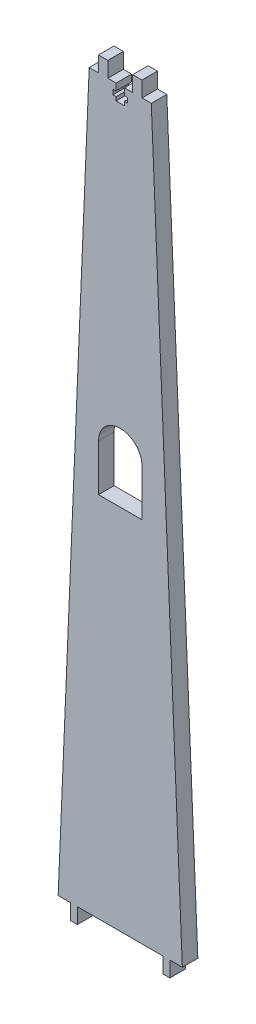
ISO-10303-21;
HEADER;
FILE_DESCRIPTION(('STEP AP214'),'2;1');
FILE_NAME('part.step','',(''),(''),'','','');
FILE_SCHEMA(('AUTOMOTIVE_DESIGN { 1 0 10303 214 1 1 1 1 }'));
ENDSEC;
DATA;
#1=APPLICATION_CONTEXT('core data for automotive mechanical design processes');
#2=APPLICATION_PROTOCOL_DEFINITION('international standard','automotive_design',2000,#1);
#3=PRODUCT_CONTEXT('',#1,'mechanical');
#4=PRODUCT('Part','Part','',(#3));
#5=PRODUCT_RELATED_PRODUCT_CATEGORY('part','',(#4));
#6=PRODUCT_DEFINITION_FORMATION('','',#4);
#7=PRODUCT_DEFINITION_CONTEXT('part definition',#1,'design');
#8=PRODUCT_DEFINITION('design','',#6,#7);
#9=PRODUCT_DEFINITION_SHAPE('','',#8);
#10=(LENGTH_UNIT() NAMED_UNIT(*) SI_UNIT(.MILLI.,.METRE.));
#11=(NAMED_UNIT(*) PLANE_ANGLE_UNIT() SI_UNIT($,.RADIAN.));
#12=(NAMED_UNIT(*) SI_UNIT($,.STERADIAN.) SOLID_ANGLE_UNIT());
#13=UNCERTAINTY_MEASURE_WITH_UNIT(LENGTH_MEASURE(1.E-05),#10,'distance_accuracy_value','');
#14=(GEOMETRIC_REPRESENTATION_CONTEXT(3) GLOBAL_UNCERTAINTY_ASSIGNED_CONTEXT((#13)) GLOBAL_UNIT_ASSIGNED_CONTEXT((#10,
#11,#12)) REPRESENTATION_CONTEXT('',''));
#15=CARTESIAN_POINT('',(0.,0.,0.));
#16=DIRECTION('',(0.,0.,1.));
#17=DIRECTION('',(1.,0.,0.));
#18=AXIS2_PLACEMENT_3D('',#15,#16,#17);
#19=CARTESIAN_POINT('',(0.,0.,6.35));
#20=DIRECTION('',(0.,0.,-1.));
#21=DIRECTION('',(-1.,0.,0.));
#22=AXIS2_PLACEMENT_3D('',#19,#20,#21);
#23=PLANE('',#22);
#24=DIRECTION('',(1.,0.,0.));
#25=VECTOR('',#24,1.);
#26=CARTESIAN_POINT('',(-25.4,0.,6.35));
#27=LINE('',#26,#25);
#28=CARTESIAN_POINT('',(-25.4,0.,6.35));
#29=VERTEX_POINT('',#28);
#30=CARTESIAN_POINT('',(-20.3200000000001,0.,6.35));
#31=VERTEX_POINT('',#30);
#32=EDGE_CURVE('E308',#29,#31,#27,.T.);
#33=ORIENTED_EDGE('',*,*,#32,.T.);
#34=DIRECTION('',(0.,-1.,0.));
#35=VECTOR('',#34,1.);
#36=CARTESIAN_POINT('',(-20.3200000000001,0.,6.35));
#37=LINE('',#36,#35);
#38=CARTESIAN_POINT('',(-20.32,-6.35,6.35));
#39=VERTEX_POINT('',#38);
#40=EDGE_CURVE('E311',#31,#39,#37,.T.);
#41=ORIENTED_EDGE('',*,*,#40,.T.);
#42=DIRECTION('',(1.,0.,0.));
#43=VECTOR('',#42,1.);
#44=CARTESIAN_POINT('',(-20.32,-6.35,6.35));
#45=LINE('',#44,#43);
#46=CARTESIAN_POINT('',(-17.5260000000001,-6.35,6.35));
#47=VERTEX_POINT('',#46);
#48=EDGE_CURVE('E314',#39,#47,#45,.T.);
#49=ORIENTED_EDGE('',*,*,#48,.T.);
#50=DIRECTION('',(0.,1.,0.));
#51=VECTOR('',#50,1.);
#52=CARTESIAN_POINT('',(-17.5260000000001,-6.35,6.35));
#53=LINE('',#52,#51);
#54=CARTESIAN_POINT('',(-17.526,0.,6.35));
#55=VERTEX_POINT('',#54);
#56=EDGE_CURVE('E316',#47,#55,#53,.T.);
#57=ORIENTED_EDGE('',*,*,#56,.T.);
#58=DIRECTION('',(1.,0.,0.));
#59=VECTOR('',#58,1.);
#60=CARTESIAN_POINT('',(-17.526,0.,6.35));
#61=LINE('',#60,#59);
#62=CARTESIAN_POINT('',(17.526,0.,6.35));
#63=VERTEX_POINT('',#62);
#64=EDGE_CURVE('E318',#55,#63,#61,.T.);
#65=ORIENTED_EDGE('',*,*,#64,.T.);
#66=DIRECTION('',(0.,-1.,0.));
#67=VECTOR('',#66,1.);
#68=CARTESIAN_POINT('',(17.5260000000001,-6.35,6.35));
#69=LINE('',#68,#67);
#70=CARTESIAN_POINT('',(17.5260000000001,-6.35,6.35));
#71=VERTEX_POINT('',#70);
#72=EDGE_CURVE('E320',#63,#71,#69,.T.);
#73=ORIENTED_EDGE('',*,*,#72,.T.);
#74=DIRECTION('',(1.,0.,0.));
#75=VECTOR('',#74,1.);
#76=CARTESIAN_POINT('',(20.3200000000001,-6.35,6.35));
#77=LINE('',#76,#75);
#78=CARTESIAN_POINT('',(20.3200000000001,-6.35,6.35));
#79=VERTEX_POINT('',#78);
#80=EDGE_CURVE('E322',#71,#79,#77,.T.);
#81=ORIENTED_EDGE('',*,*,#80,.T.);
#82=DIRECTION('',(0.,1.,0.));
#83=VECTOR('',#82,1.);
#84=CARTESIAN_POINT('',(20.3200000000001,0.,6.35));
#85=LINE('',#84,#83);
#86=CARTESIAN_POINT('',(20.3200000000001,0.,6.35));
#87=VERTEX_POINT('',#86);
#88=EDGE_CURVE('E324',#79,#87,#85,.T.);
#89=ORIENTED_EDGE('',*,*,#88,.T.);
#90=DIRECTION('',(1.,0.,0.));
#91=VECTOR('',#90,1.);
#92=CARTESIAN_POINT('',(25.4,0.,6.35));
#93=LINE('',#92,#91);
#94=CARTESIAN_POINT('',(25.4,0.,6.35));
#95=VERTEX_POINT('',#94);
#96=EDGE_CURVE('E326',#87,#95,#93,.T.);
#97=ORIENTED_EDGE('',*,*,#96,.T.);
#98=DIRECTION('',(-0.0423348930736044,0.999103476537064,0.));
#99=VECTOR('',#98,1.);
#100=CARTESIAN_POINT('',(25.4,0.,6.35));
#101=LINE('',#100,#99);
#102=CARTESIAN_POINT('',(12.7,299.72,6.35));
#103=VERTEX_POINT('',#102);
#104=EDGE_CURVE('E328',#95,#103,#101,.T.);
#105=ORIENTED_EDGE('',*,*,#104,.T.);
#106=DIRECTION('',(-1.,0.,0.));
#107=VECTOR('',#106,1.);
#108=CARTESIAN_POINT('',(12.7,299.72,6.35));
#109=LINE('',#108,#107);
#110=CARTESIAN_POINT('',(8.89,299.72,6.35));
#111=VERTEX_POINT('',#110);
#112=EDGE_CURVE('E330',#103,#111,#109,.T.);
#113=ORIENTED_EDGE('',*,*,#112,.T.);
#114=DIRECTION('',(0.,1.,0.));
#115=VECTOR('',#114,1.);
#116=CARTESIAN_POINT('',(8.89,306.07,6.35));
#117=LINE('',#116,#115);
#118=CARTESIAN_POINT('',(8.89,306.07,6.35));
#119=VERTEX_POINT('',#118);
#120=EDGE_CURVE('E332',#111,#119,#117,.T.);
#121=ORIENTED_EDGE('',*,*,#120,.T.);
#122=DIRECTION('',(-1.,0.,0.));
#123=VECTOR('',#122,1.);
#124=CARTESIAN_POINT('',(8.89,306.07,6.35));
#125=LINE('',#124,#123);
#126=CARTESIAN_POINT('',(5.08,306.07,6.35));
#127=VERTEX_POINT('',#126);
#128=EDGE_CURVE('E334',#119,#127,#125,.T.);
#129=ORIENTED_EDGE('',*,*,#128,.T.);
#130=DIRECTION('',(0.,-1.,0.));
#131=VECTOR('',#130,1.);
#132=CARTESIAN_POINT('',(5.08,306.07,6.35));
#133=LINE('',#132,#131);
#134=CARTESIAN_POINT('',(5.08,299.72,6.35));
#135=VERTEX_POINT('',#134);
#136=EDGE_CURVE('E336',#127,#135,#133,.T.);
#137=ORIENTED_EDGE('',*,*,#136,.T.);
#138=DIRECTION('',(-1.,0.,0.));
#139=VECTOR('',#138,1.);
#140=CARTESIAN_POINT('',(5.08,299.72,6.35));
#141=LINE('',#140,#139);
#142=CARTESIAN_POINT('',(1.7,299.72,6.35));
#143=VERTEX_POINT('',#142);
#144=EDGE_CURVE('E338',#135,#143,#141,.T.);
#145=ORIENTED_EDGE('',*,*,#144,.T.);
#146=DIRECTION('',(0.,-1.,0.));
#147=VECTOR('',#146,1.);
#148=CARTESIAN_POINT('',(1.7,299.72,6.35));
#149=LINE('',#148,#147);
#150=CARTESIAN_POINT('',(1.7,296.926,6.35));
#151=VERTEX_POINT('',#150);
#152=EDGE_CURVE('E340',#143,#151,#149,.T.);
#153=ORIENTED_EDGE('',*,*,#152,.T.);
#154=DIRECTION('',(1.,0.,0.));
#155=VECTOR('',#154,1.);
#156=CARTESIAN_POINT('',(1.7,296.926,6.35));
#157=LINE('',#156,#155);
#158=CARTESIAN_POINT('',(2.97,296.926,6.35));
#159=VERTEX_POINT('',#158);
#160=EDGE_CURVE('E342',#151,#159,#157,.T.);
#161=ORIENTED_EDGE('',*,*,#160,.T.);
#162=DIRECTION('',(0.,-1.,0.));
#163=VECTOR('',#162,1.);
#164=CARTESIAN_POINT('',(2.97,296.926,6.35));
#165=LINE('',#164,#163);
#166=CARTESIAN_POINT('',(2.97,294.894,6.35));
#167=VERTEX_POINT('',#166);
#168=EDGE_CURVE('E344',#159,#167,#165,.T.);
#169=ORIENTED_EDGE('',*,*,#168,.T.);
#170=DIRECTION('',(-1.,0.,0.));
#171=VECTOR('',#170,1.);
#172=CARTESIAN_POINT('',(2.97,294.894,6.35));
#173=LINE('',#172,#171);
#174=CARTESIAN_POINT('',(1.7,294.894,6.35));
#175=VERTEX_POINT('',#174);
#176=EDGE_CURVE('E346',#167,#175,#173,.T.);
#177=ORIENTED_EDGE('',*,*,#176,.T.);
#178=DIRECTION('',(0.,-1.,0.));
#179=VECTOR('',#178,1.);
#180=CARTESIAN_POINT('',(1.7,294.894,6.35));
#181=LINE('',#180,#179);
#182=CARTESIAN_POINT('',(1.7,293.37,6.35));
#183=VERTEX_POINT('',#182);
#184=EDGE_CURVE('E348',#175,#183,#181,.T.);
#185=ORIENTED_EDGE('',*,*,#184,.T.);
#186=DIRECTION('',(-1.,0.,0.));
#187=VECTOR('',#186,1.);
#188=CARTESIAN_POINT('',(1.7,293.37,6.35));
#189=LINE('',#188,#187);
#190=CARTESIAN_POINT('',(-1.7,293.37,6.35));
#191=VERTEX_POINT('',#190);
#192=EDGE_CURVE('E350',#183,#191,#189,.T.);
#193=ORIENTED_EDGE('',*,*,#192,.T.);
#194=DIRECTION('',(0.,1.,0.));
#195=VECTOR('',#194,1.);
#196=CARTESIAN_POINT('',(-1.7,294.894,6.35));
#197=LINE('',#196,#195);
#198=CARTESIAN_POINT('',(-1.7,294.894,6.35));
#199=VERTEX_POINT('',#198);
#200=EDGE_CURVE('E352',#191,#199,#197,.T.);
#201=ORIENTED_EDGE('',*,*,#200,.T.);
#202=DIRECTION('',(-1.,0.,0.));
#203=VECTOR('',#202,1.);
#204=CARTESIAN_POINT('',(-2.97,294.894,6.35));
#205=LINE('',#204,#203);
#206=CARTESIAN_POINT('',(-2.97,294.894,6.35));
#207=VERTEX_POINT('',#206);
#208=EDGE_CURVE('E354',#199,#207,#205,.T.);
#209=ORIENTED_EDGE('',*,*,#208,.T.);
#210=DIRECTION('',(0.,1.,0.));
#211=VECTOR('',#210,1.);
#212=CARTESIAN_POINT('',(-2.97,296.926,6.35));
#213=LINE('',#212,#211);
#214=CARTESIAN_POINT('',(-2.97,296.926,6.35));
#215=VERTEX_POINT('',#214);
#216=EDGE_CURVE('E356',#207,#215,#213,.T.);
#217=ORIENTED_EDGE('',*,*,#216,.T.);
#218=DIRECTION('',(1.,0.,0.));
#219=VECTOR('',#218,1.);
#220=CARTESIAN_POINT('',(-1.7,296.926,6.35));
#221=LINE('',#220,#219);
#222=CARTESIAN_POINT('',(-1.7,296.926,6.35));
#223=VERTEX_POINT('',#222);
#224=EDGE_CURVE('E358',#215,#223,#221,.T.);
#225=ORIENTED_EDGE('',*,*,#224,.T.);
#226=DIRECTION('',(0.,1.,0.));
#227=VECTOR('',#226,1.);
#228=CARTESIAN_POINT('',(-1.7,299.72,6.35));
#229=LINE('',#228,#227);
#230=CARTESIAN_POINT('',(-1.7,299.72,6.35));
#231=VERTEX_POINT('',#230);
#232=EDGE_CURVE('E360',#223,#231,#229,.T.);
#233=ORIENTED_EDGE('',*,*,#232,.T.);
#234=DIRECTION('',(-1.,0.,0.));
#235=VECTOR('',#234,1.);
#236=CARTESIAN_POINT('',(-5.08,299.72,6.35));
#237=LINE('',#236,#235);
#238=CARTESIAN_POINT('',(-5.08,299.72,6.35));
#239=VERTEX_POINT('',#238);
#240=EDGE_CURVE('E362',#231,#239,#237,.T.);
#241=ORIENTED_EDGE('',*,*,#240,.T.);
#242=DIRECTION('',(0.,1.,0.));
#243=VECTOR('',#242,1.);
#244=CARTESIAN_POINT('',(-5.08,306.07,6.35));
#245=LINE('',#244,#243);
#246=CARTESIAN_POINT('',(-5.08,306.07,6.35));
#247=VERTEX_POINT('',#246);
#248=EDGE_CURVE('E364',#239,#247,#245,.T.);
#249=ORIENTED_EDGE('',*,*,#248,.T.);
#250=DIRECTION('',(-1.,0.,0.));
#251=VECTOR('',#250,1.);
#252=CARTESIAN_POINT('',(-8.89,306.07,6.35));
#253=LINE('',#252,#251);
#254=CARTESIAN_POINT('',(-8.89,306.07,6.35));
#255=VERTEX_POINT('',#254);
#256=EDGE_CURVE('E366',#247,#255,#253,.T.);
#257=ORIENTED_EDGE('',*,*,#256,.T.);
#258=DIRECTION('',(0.,-1.,0.));
#259=VECTOR('',#258,1.);
#260=CARTESIAN_POINT('',(-8.89,306.07,6.35));
#261=LINE('',#260,#259);
#262=CARTESIAN_POINT('',(-8.89,299.72,6.35));
#263=VERTEX_POINT('',#262);
#264=EDGE_CURVE('E368',#255,#263,#261,.T.);
#265=ORIENTED_EDGE('',*,*,#264,.T.);
#266=DIRECTION('',(-1.,0.,0.));
#267=VECTOR('',#266,1.);
#268=CARTESIAN_POINT('',(-12.7,299.72,6.35));
#269=LINE('',#268,#267);
#270=CARTESIAN_POINT('',(-12.7,299.72,6.35));
#271=VERTEX_POINT('',#270);
#272=EDGE_CURVE('E370',#263,#271,#269,.T.);
#273=ORIENTED_EDGE('',*,*,#272,.T.);
#274=DIRECTION('',(-0.0423348930736044,-0.999103476537064,0.));
#275=VECTOR('',#274,1.);
#276=CARTESIAN_POINT('',(-12.7,299.72,6.35));
#277=LINE('',#276,#275);
#278=EDGE_CURVE('E372',#271,#29,#277,.T.);
#279=ORIENTED_EDGE('',*,*,#278,.T.);
#280=EDGE_LOOP('',(#33,#41,#49,#57,#65,#73,#81,#89,#97,#105,#113,#121,#129,#137,#145,#153,#161,
#169,#177,#185,#193,#201,#209,#217,#225,#233,#241,#249,#257,#265,#273,#279));
#281=FACE_BOUND('',#280,.T.);
#282=DIRECTION('',(0.,-1.,0.));
#283=VECTOR('',#282,1.);
#284=CARTESIAN_POINT('',(-8.89,169.347214184084,6.35));
#285=LINE('',#284,#283);
#286=CARTESIAN_POINT('',(-8.89,169.347214184084,6.35));
#287=VERTEX_POINT('',#286);
#288=CARTESIAN_POINT('',(-8.89,150.297214184084,6.35));
#289=VERTEX_POINT('',#288);
#290=EDGE_CURVE('E272',#287,#289,#285,.T.);
#291=ORIENTED_EDGE('',*,*,#290,.F.);
#292=CARTESIAN_POINT('',(0.,169.347214184084,6.35));
#293=DIRECTION('',(0.,0.,1.));
#294=DIRECTION('',(-1.,0.,0.));
#295=AXIS2_PLACEMENT_3D('',#292,#293,#294);
#296=CIRCLE('',#295,8.89);
#297=CARTESIAN_POINT('',(8.88999999999999,169.347214184084,6.35));
#298=VERTEX_POINT('',#297);
#299=EDGE_CURVE('E294',#298,#287,#296,.T.);
#300=ORIENTED_EDGE('',*,*,#299,.F.);
#301=DIRECTION('',(0.,1.,0.));
#302=VECTOR('',#301,1.);
#303=CARTESIAN_POINT('',(8.89,169.347214184084,6.35));
#304=LINE('',#303,#302);
#305=CARTESIAN_POINT('',(8.89,150.297214184084,6.35));
#306=VERTEX_POINT('',#305);
#307=EDGE_CURVE('E292',#306,#298,#304,.T.);
#308=ORIENTED_EDGE('',*,*,#307,.F.);
#309=DIRECTION('',(1.,0.,0.));
#310=VECTOR('',#309,1.);
#311=CARTESIAN_POINT('',(-8.89,150.297214184084,6.35));
#312=LINE('',#311,#310);
#313=EDGE_CURVE('E280',#289,#306,#312,.T.);
#314=ORIENTED_EDGE('',*,*,#313,.F.);
#315=EDGE_LOOP('',(#291,#300,#308,#314));
#316=FACE_BOUND('',#315,.T.);
#317=ADVANCED_FACE('F39',(#281,#316),#23,.F.);
#318=CARTESIAN_POINT('',(0.,0.,0.));
#319=DIRECTION('',(0.,0.,-1.));
#320=DIRECTION('',(-1.,0.,0.));
#321=AXIS2_PLACEMENT_3D('',#318,#319,#320);
#322=PLANE('',#321);
#323=DIRECTION('',(1.,0.,0.));
#324=VECTOR('',#323,1.);
#325=CARTESIAN_POINT('',(-25.4,0.,0.));
#326=LINE('',#325,#324);
#327=CARTESIAN_POINT('',(-25.4,0.,0.));
#328=VERTEX_POINT('',#327);
#329=CARTESIAN_POINT('',(-20.3200000000001,0.,0.));
#330=VERTEX_POINT('',#329);
#331=EDGE_CURVE('E288',#328,#330,#326,.T.);
#332=ORIENTED_EDGE('',*,*,#331,.F.);
#333=DIRECTION('',(-0.0423348930736044,-0.999103476537064,0.));
#334=VECTOR('',#333,1.);
#335=CARTESIAN_POINT('',(-12.7,299.72,0.));
#336=LINE('',#335,#334);
#337=CARTESIAN_POINT('',(-12.7,299.72,0.));
#338=VERTEX_POINT('',#337);
#339=EDGE_CURVE('E312',#338,#328,#336,.T.);
#340=ORIENTED_EDGE('',*,*,#339,.F.);
#341=DIRECTION('',(-1.,0.,0.));
#342=VECTOR('',#341,1.);
#343=CARTESIAN_POINT('',(-12.7,299.72,0.));
#344=LINE('',#343,#342);
#345=CARTESIAN_POINT('',(-8.89,299.72,0.));
#346=VERTEX_POINT('',#345);
#347=EDGE_CURVE('E435',#346,#338,#344,.T.);
#348=ORIENTED_EDGE('',*,*,#347,.F.);
#349=DIRECTION('',(0.,-1.,0.));
#350=VECTOR('',#349,1.);
#351=CARTESIAN_POINT('',(-8.89,306.07,0.));
#352=LINE('',#351,#350);
#353=CARTESIAN_POINT('',(-8.89,306.07,0.));
#354=VERTEX_POINT('',#353);
#355=EDGE_CURVE('E433',#354,#346,#352,.T.);
#356=ORIENTED_EDGE('',*,*,#355,.F.);
#357=DIRECTION('',(-1.,0.,0.));
#358=VECTOR('',#357,1.);
#359=CARTESIAN_POINT('',(-8.89,306.07,0.));
#360=LINE('',#359,#358);
#361=CARTESIAN_POINT('',(-5.08,306.07,0.));
#362=VERTEX_POINT('',#361);
#363=EDGE_CURVE('E431',#362,#354,#360,.T.);
#364=ORIENTED_EDGE('',*,*,#363,.F.);
#365=DIRECTION('',(0.,1.,0.));
#366=VECTOR('',#365,1.);
#367=CARTESIAN_POINT('',(-5.08,306.07,0.));
#368=LINE('',#367,#366);
#369=CARTESIAN_POINT('',(-5.08,299.72,0.));
#370=VERTEX_POINT('',#369);
#371=EDGE_CURVE('E429',#370,#362,#368,.T.);
#372=ORIENTED_EDGE('',*,*,#371,.F.);
#373=DIRECTION('',(-1.,0.,0.));
#374=VECTOR('',#373,1.);
#375=CARTESIAN_POINT('',(-5.08,299.72,0.));
#376=LINE('',#375,#374);
#377=CARTESIAN_POINT('',(-1.7,299.72,0.));
#378=VERTEX_POINT('',#377);
#379=EDGE_CURVE('E427',#378,#370,#376,.T.);
#380=ORIENTED_EDGE('',*,*,#379,.F.);
#381=DIRECTION('',(0.,1.,0.));
#382=VECTOR('',#381,1.);
#383=CARTESIAN_POINT('',(-1.7,299.72,0.));
#384=LINE('',#383,#382);
#385=CARTESIAN_POINT('',(-1.7,296.926,0.));
#386=VERTEX_POINT('',#385);
#387=EDGE_CURVE('E425',#386,#378,#384,.T.);
#388=ORIENTED_EDGE('',*,*,#387,.F.);
#389=DIRECTION('',(1.,0.,0.));
#390=VECTOR('',#389,1.);
#391=CARTESIAN_POINT('',(-1.7,296.926,0.));
#392=LINE('',#391,#390);
#393=CARTESIAN_POINT('',(-2.97,296.926,0.));
#394=VERTEX_POINT('',#393);
#395=EDGE_CURVE('E423',#394,#386,#392,.T.);
#396=ORIENTED_EDGE('',*,*,#395,.F.);
#397=DIRECTION('',(0.,1.,0.));
#398=VECTOR('',#397,1.);
#399=CARTESIAN_POINT('',(-2.97,296.926,0.));
#400=LINE('',#399,#398);
#401=CARTESIAN_POINT('',(-2.97,294.894,0.));
#402=VERTEX_POINT('',#401);
#403=EDGE_CURVE('E421',#402,#394,#400,.T.);
#404=ORIENTED_EDGE('',*,*,#403,.F.);
#405=DIRECTION('',(-1.,0.,0.));
#406=VECTOR('',#405,1.);
#407=CARTESIAN_POINT('',(-2.97,294.894,0.));
#408=LINE('',#407,#406);
#409=CARTESIAN_POINT('',(-1.7,294.894,0.));
#410=VERTEX_POINT('',#409);
#411=EDGE_CURVE('E419',#410,#402,#408,.T.);
#412=ORIENTED_EDGE('',*,*,#411,.F.);
#413=DIRECTION('',(0.,1.,0.));
#414=VECTOR('',#413,1.);
#415=CARTESIAN_POINT('',(-1.7,294.894,0.));
#416=LINE('',#415,#414);
#417=CARTESIAN_POINT('',(-1.7,293.37,0.));
#418=VERTEX_POINT('',#417);
#419=EDGE_CURVE('E417',#418,#410,#416,.T.);
#420=ORIENTED_EDGE('',*,*,#419,.F.);
#421=DIRECTION('',(-1.,0.,0.));
#422=VECTOR('',#421,1.);
#423=CARTESIAN_POINT('',(1.7,293.37,0.));
#424=LINE('',#423,#422);
#425=CARTESIAN_POINT('',(1.7,293.37,0.));
#426=VERTEX_POINT('',#425);
#427=EDGE_CURVE('E415',#426,#418,#424,.T.);
#428=ORIENTED_EDGE('',*,*,#427,.F.);
#429=DIRECTION('',(0.,-1.,0.));
#430=VECTOR('',#429,1.);
#431=CARTESIAN_POINT('',(1.7,294.894,0.));
#432=LINE('',#431,#430);
#433=CARTESIAN_POINT('',(1.7,294.894,0.));
#434=VERTEX_POINT('',#433);
#435=EDGE_CURVE('E413',#434,#426,#432,.T.);
#436=ORIENTED_EDGE('',*,*,#435,.F.);
#437=DIRECTION('',(-1.,0.,0.));
#438=VECTOR('',#437,1.);
#439=CARTESIAN_POINT('',(2.97,294.894,0.));
#440=LINE('',#439,#438);
#441=CARTESIAN_POINT('',(2.97,294.894,0.));
#442=VERTEX_POINT('',#441);
#443=EDGE_CURVE('E411',#442,#434,#440,.T.);
#444=ORIENTED_EDGE('',*,*,#443,.F.);
#445=DIRECTION('',(0.,-1.,0.));
#446=VECTOR('',#445,1.);
#447=CARTESIAN_POINT('',(2.97,296.926,0.));
#448=LINE('',#447,#446);
#449=CARTESIAN_POINT('',(2.97,296.926,0.));
#450=VERTEX_POINT('',#449);
#451=EDGE_CURVE('E409',#450,#442,#448,.T.);
#452=ORIENTED_EDGE('',*,*,#451,.F.);
#453=DIRECTION('',(1.,0.,0.));
#454=VECTOR('',#453,1.);
#455=CARTESIAN_POINT('',(1.7,296.926,0.));
#456=LINE('',#455,#454);
#457=CARTESIAN_POINT('',(1.7,296.926,0.));
#458=VERTEX_POINT('',#457);
#459=EDGE_CURVE('E407',#458,#450,#456,.T.);
#460=ORIENTED_EDGE('',*,*,#459,.F.);
#461=DIRECTION('',(0.,-1.,0.));
#462=VECTOR('',#461,1.);
#463=CARTESIAN_POINT('',(1.7,299.72,0.));
#464=LINE('',#463,#462);
#465=CARTESIAN_POINT('',(1.7,299.72,0.));
#466=VERTEX_POINT('',#465);
#467=EDGE_CURVE('E405',#466,#458,#464,.T.);
#468=ORIENTED_EDGE('',*,*,#467,.F.);
#469=DIRECTION('',(-1.,0.,0.));
#470=VECTOR('',#469,1.);
#471=CARTESIAN_POINT('',(5.08,299.72,0.));
#472=LINE('',#471,#470);
#473=CARTESIAN_POINT('',(5.08,299.72,0.));
#474=VERTEX_POINT('',#473);
#475=EDGE_CURVE('E403',#474,#466,#472,.T.);
#476=ORIENTED_EDGE('',*,*,#475,.F.);
#477=DIRECTION('',(0.,-1.,0.));
#478=VECTOR('',#477,1.);
#479=CARTESIAN_POINT('',(5.08,306.07,0.));
#480=LINE('',#479,#478);
#481=CARTESIAN_POINT('',(5.08,306.07,0.));
#482=VERTEX_POINT('',#481);
#483=EDGE_CURVE('E401',#482,#474,#480,.T.);
#484=ORIENTED_EDGE('',*,*,#483,.F.);
#485=DIRECTION('',(-1.,0.,0.));
#486=VECTOR('',#485,1.);
#487=CARTESIAN_POINT('',(8.89,306.07,0.));
#488=LINE('',#487,#486);
#489=CARTESIAN_POINT('',(8.89,306.07,0.));
#490=VERTEX_POINT('',#489);
#491=EDGE_CURVE('E399',#490,#482,#488,.T.);
#492=ORIENTED_EDGE('',*,*,#491,.F.);
#493=DIRECTION('',(0.,1.,0.));
#494=VECTOR('',#493,1.);
#495=CARTESIAN_POINT('',(8.89,306.07,0.));
#496=LINE('',#495,#494);
#497=CARTESIAN_POINT('',(8.89,299.72,0.));
#498=VERTEX_POINT('',#497);
#499=EDGE_CURVE('E397',#498,#490,#496,.T.);
#500=ORIENTED_EDGE('',*,*,#499,.F.);
#501=DIRECTION('',(-1.,0.,0.));
#502=VECTOR('',#501,1.);
#503=CARTESIAN_POINT('',(12.7,299.72,0.));
#504=LINE('',#503,#502);
#505=CARTESIAN_POINT('',(12.7,299.72,0.));
#506=VERTEX_POINT('',#505);
#507=EDGE_CURVE('E395',#506,#498,#504,.T.);
#508=ORIENTED_EDGE('',*,*,#507,.F.);
#509=DIRECTION('',(-0.0423348930736044,0.999103476537064,0.));
#510=VECTOR('',#509,1.);
#511=CARTESIAN_POINT('',(25.4,0.,0.));
#512=LINE('',#511,#510);
#513=CARTESIAN_POINT('',(25.4,0.,0.));
#514=VERTEX_POINT('',#513);
#515=EDGE_CURVE('E393',#514,#506,#512,.T.);
#516=ORIENTED_EDGE('',*,*,#515,.F.);
#517=DIRECTION('',(1.,0.,0.));
#518=VECTOR('',#517,1.);
#519=CARTESIAN_POINT('',(25.4,0.,0.));
#520=LINE('',#519,#518);
#521=CARTESIAN_POINT('',(20.3200000000001,0.,0.));
#522=VERTEX_POINT('',#521);
#523=EDGE_CURVE('E391',#522,#514,#520,.T.);
#524=ORIENTED_EDGE('',*,*,#523,.F.);
#525=DIRECTION('',(0.,1.,0.));
#526=VECTOR('',#525,1.);
#527=CARTESIAN_POINT('',(20.3200000000001,0.,0.));
#528=LINE('',#527,#526);
#529=CARTESIAN_POINT('',(20.3200000000001,-6.35,0.));
#530=VERTEX_POINT('',#529);
#531=EDGE_CURVE('E389',#530,#522,#528,.T.);
#532=ORIENTED_EDGE('',*,*,#531,.F.);
#533=DIRECTION('',(1.,0.,0.));
#534=VECTOR('',#533,1.);
#535=CARTESIAN_POINT('',(20.3200000000001,-6.35,0.));
#536=LINE('',#535,#534);
#537=CARTESIAN_POINT('',(17.5260000000001,-6.35,0.));
#538=VERTEX_POINT('',#537);
#539=EDGE_CURVE('E387',#538,#530,#536,.T.);
#540=ORIENTED_EDGE('',*,*,#539,.F.);
#541=DIRECTION('',(0.,-1.,0.));
#542=VECTOR('',#541,1.);
#543=CARTESIAN_POINT('',(17.5260000000001,-6.35,0.));
#544=LINE('',#543,#542);
#545=CARTESIAN_POINT('',(17.526,0.,0.));
#546=VERTEX_POINT('',#545);
#547=EDGE_CURVE('E385',#546,#538,#544,.T.);
#548=ORIENTED_EDGE('',*,*,#547,.F.);
#549=DIRECTION('',(1.,0.,0.));
#550=VECTOR('',#549,1.);
#551=CARTESIAN_POINT('',(-17.526,0.,0.));
#552=LINE('',#551,#550);
#553=CARTESIAN_POINT('',(-17.526,0.,0.));
#554=VERTEX_POINT('',#553);
#555=EDGE_CURVE('E383',#554,#546,#552,.T.);
#556=ORIENTED_EDGE('',*,*,#555,.F.);
#557=DIRECTION('',(0.,1.,0.));
#558=VECTOR('',#557,1.);
#559=CARTESIAN_POINT('',(-17.5260000000001,-6.35,0.));
#560=LINE('',#559,#558);
#561=CARTESIAN_POINT('',(-17.5260000000001,-6.35,0.));
#562=VERTEX_POINT('',#561);
#563=EDGE_CURVE('E381',#562,#554,#560,.T.);
#564=ORIENTED_EDGE('',*,*,#563,.F.);
#565=DIRECTION('',(1.,0.,0.));
#566=VECTOR('',#565,1.);
#567=CARTESIAN_POINT('',(-20.32,-6.35,0.));
#568=LINE('',#567,#566);
#569=CARTESIAN_POINT('',(-20.32,-6.35,0.));
#570=VERTEX_POINT('',#569);
#571=EDGE_CURVE('E379',#570,#562,#568,.T.);
#572=ORIENTED_EDGE('',*,*,#571,.F.);
#573=DIRECTION('',(0.,-1.,0.));
#574=VECTOR('',#573,1.);
#575=CARTESIAN_POINT('',(-20.3200000000001,0.,0.));
#576=LINE('',#575,#574);
#577=EDGE_CURVE('E377',#330,#570,#576,.T.);
#578=ORIENTED_EDGE('',*,*,#577,.F.);
#579=EDGE_LOOP('',(#332,#340,#348,#356,#364,#372,#380,#388,#396,#404,#412,#420,#428,#436,#444,
#452,#460,#468,#476,#484,#492,#500,#508,#516,#524,#532,#540,#548,#556,#564,#572,#578));
#580=FACE_BOUND('',#579,.T.);
#581=CARTESIAN_POINT('',(0.,169.347214184084,0.));
#582=DIRECTION('',(0.,0.,1.));
#583=DIRECTION('',(-1.,0.,0.));
#584=AXIS2_PLACEMENT_3D('',#581,#582,#583);
#585=CIRCLE('',#584,8.89);
#586=CARTESIAN_POINT('',(8.89,169.347214184084,0.));
#587=VERTEX_POINT('',#586);
#588=CARTESIAN_POINT('',(-8.89,169.347214184084,0.));
#589=VERTEX_POINT('',#588);
#590=EDGE_CURVE('E281',#587,#589,#585,.T.);
#591=ORIENTED_EDGE('',*,*,#590,.T.);
#592=DIRECTION('',(0.,-1.,0.));
#593=VECTOR('',#592,1.);
#594=CARTESIAN_POINT('',(-8.89,169.347214184084,0.));
#595=LINE('',#594,#593);
#596=CARTESIAN_POINT('',(-8.89,150.297214184084,0.));
#597=VERTEX_POINT('',#596);
#598=EDGE_CURVE('E62',#589,#597,#595,.T.);
#599=ORIENTED_EDGE('',*,*,#598,.T.);
#600=DIRECTION('',(1.,0.,0.));
#601=VECTOR('',#600,1.);
#602=CARTESIAN_POINT('',(-8.89,150.297214184084,0.));
#603=LINE('',#602,#601);
#604=CARTESIAN_POINT('',(8.89,150.297214184084,0.));
#605=VERTEX_POINT('',#604);
#606=EDGE_CURVE('E287',#597,#605,#603,.T.);
#607=ORIENTED_EDGE('',*,*,#606,.T.);
#608=DIRECTION('',(0.,1.,0.));
#609=VECTOR('',#608,1.);
#610=CARTESIAN_POINT('',(8.89,169.347214184084,0.));
#611=LINE('',#610,#609);
#612=EDGE_CURVE('E300',#605,#587,#611,.T.);
#613=ORIENTED_EDGE('',*,*,#612,.T.);
#614=EDGE_LOOP('',(#591,#599,#607,#613));
#615=FACE_BOUND('',#614,.T.);
#616=ADVANCED_FACE('F537',(#580,#615),#322,.T.);
#617=CARTESIAN_POINT('',(-25.4,0.,6.35));
#618=DIRECTION('',(0.,1.,0.));
#619=DIRECTION('',(-1.,0.,0.));
#620=AXIS2_PLACEMENT_3D('',#617,#618,#619);
#621=PLANE('',#620);
#622=ORIENTED_EDGE('',*,*,#331,.T.);
#623=DIRECTION('',(0.,0.,-1.));
#624=VECTOR('',#623,1.);
#625=CARTESIAN_POINT('',(-20.3200000000001,0.,6.35));
#626=LINE('',#625,#624);
#627=EDGE_CURVE('E11',#31,#330,#626,.T.);
#628=ORIENTED_EDGE('',*,*,#627,.F.);
#629=ORIENTED_EDGE('',*,*,#32,.F.);
#630=DIRECTION('',(0.,0.,-1.));
#631=VECTOR('',#630,1.);
#632=CARTESIAN_POINT('',(-25.4,0.,6.35));
#633=LINE('',#632,#631);
#634=EDGE_CURVE('E374',#29,#328,#633,.T.);
#635=ORIENTED_EDGE('',*,*,#634,.T.);
#636=EDGE_LOOP('',(#622,#628,#629,#635));
#637=FACE_BOUND('',#636,.T.);
#638=ADVANCED_FACE('F41',(#637),#621,.F.);
#639=CARTESIAN_POINT('',(-20.3200000000001,0.,6.35));
#640=DIRECTION('',(1.,0.,0.));
#641=DIRECTION('',(0.,1.,0.));
#642=AXIS2_PLACEMENT_3D('',#639,#640,#641);
#643=PLANE('',#642);
#644=ORIENTED_EDGE('',*,*,#577,.T.);
#645=DIRECTION('',(0.,0.,-1.));
#646=VECTOR('',#645,1.);
#647=CARTESIAN_POINT('',(-20.32,-6.35,6.35));
#648=LINE('',#647,#646);
#649=EDGE_CURVE('E47',#39,#570,#648,.T.);
#650=ORIENTED_EDGE('',*,*,#649,.F.);
#651=ORIENTED_EDGE('',*,*,#40,.F.);
#652=ORIENTED_EDGE('',*,*,#627,.T.);
#653=EDGE_LOOP('',(#644,#650,#651,#652));
#654=FACE_BOUND('',#653,.T.);
#655=ADVANCED_FACE('F554',(#654),#643,.F.);
#656=CARTESIAN_POINT('',(-20.32,-6.35,6.35));
#657=DIRECTION('',(0.,1.,0.));
#658=DIRECTION('',(-1.,0.,0.));
#659=AXIS2_PLACEMENT_3D('',#656,#657,#658);
#660=PLANE('',#659);
#661=ORIENTED_EDGE('',*,*,#571,.T.);
#662=DIRECTION('',(0.,0.,-1.));
#663=VECTOR('',#662,1.);
#664=CARTESIAN_POINT('',(-17.5260000000001,-6.35,6.35));
#665=LINE('',#664,#663);
#666=EDGE_CURVE('E524',#47,#562,#665,.T.);
#667=ORIENTED_EDGE('',*,*,#666,.F.);
#668=ORIENTED_EDGE('',*,*,#48,.F.);
#669=ORIENTED_EDGE('',*,*,#649,.T.);
#670=EDGE_LOOP('',(#661,#667,#668,#669));
#671=FACE_BOUND('',#670,.T.);
#672=ADVANCED_FACE('F531',(#671),#660,.F.);
#673=CARTESIAN_POINT('',(-17.5260000000001,-6.35,6.35));
#674=DIRECTION('',(-1.,0.,0.));
#675=DIRECTION('',(0.,-1.,0.));
#676=AXIS2_PLACEMENT_3D('',#673,#674,#675);
#677=PLANE('',#676);
#678=ORIENTED_EDGE('',*,*,#563,.T.);
#679=DIRECTION('',(0.,0.,-1.));
#680=VECTOR('',#679,1.);
#681=CARTESIAN_POINT('',(-17.526,0.,6.35));
#682=LINE('',#681,#680);
#683=EDGE_CURVE('E521',#55,#554,#682,.T.);
#684=ORIENTED_EDGE('',*,*,#683,.F.);
#685=ORIENTED_EDGE('',*,*,#56,.F.);
#686=ORIENTED_EDGE('',*,*,#666,.T.);
#687=EDGE_LOOP('',(#678,#684,#685,#686));
#688=FACE_BOUND('',#687,.T.);
#689=ADVANCED_FACE('F543',(#688),#677,.F.);
#690=CARTESIAN_POINT('',(-17.526,0.,6.35));
#691=DIRECTION('',(0.,1.,0.));
#692=DIRECTION('',(0.,0.,1.));
#693=AXIS2_PLACEMENT_3D('',#690,#691,#692);
#694=PLANE('',#693);
#695=ORIENTED_EDGE('',*,*,#555,.T.);
#696=DIRECTION('',(0.,0.,-1.));
#697=VECTOR('',#696,1.);
#698=CARTESIAN_POINT('',(17.526,0.,6.35));
#699=LINE('',#698,#697);
#700=EDGE_CURVE('E518',#63,#546,#699,.T.);
#701=ORIENTED_EDGE('',*,*,#700,.F.);
#702=ORIENTED_EDGE('',*,*,#64,.F.);
#703=ORIENTED_EDGE('',*,*,#683,.T.);
#704=EDGE_LOOP('',(#695,#701,#702,#703));
#705=FACE_BOUND('',#704,.T.);
#706=ADVANCED_FACE('F547',(#705),#694,.F.);
#707=CARTESIAN_POINT('',(17.5260000000001,-6.35,6.35));
#708=DIRECTION('',(1.,0.,0.));
#709=DIRECTION('',(0.,1.,0.));
#710=AXIS2_PLACEMENT_3D('',#707,#708,#709);
#711=PLANE('',#710);
#712=ORIENTED_EDGE('',*,*,#547,.T.);
#713=DIRECTION('',(0.,0.,-1.));
#714=VECTOR('',#713,1.);
#715=CARTESIAN_POINT('',(17.5260000000001,-6.35,6.35));
#716=LINE('',#715,#714);
#717=EDGE_CURVE('E515',#71,#538,#716,.T.);
#718=ORIENTED_EDGE('',*,*,#717,.F.);
#719=ORIENTED_EDGE('',*,*,#72,.F.);
#720=ORIENTED_EDGE('',*,*,#700,.T.);
#721=EDGE_LOOP('',(#712,#718,#719,#720));
#722=FACE_BOUND('',#721,.T.);
#723=ADVANCED_FACE('F687',(#722),#711,.F.);
#724=CARTESIAN_POINT('',(20.3200000000001,-6.35,6.35));
#725=DIRECTION('',(0.,1.,0.));
#726=DIRECTION('',(0.,0.,1.));
#727=AXIS2_PLACEMENT_3D('',#724,#725,#726);
#728=PLANE('',#727);
#729=ORIENTED_EDGE('',*,*,#539,.T.);
#730=DIRECTION('',(0.,0.,-1.));
#731=VECTOR('',#730,1.);
#732=CARTESIAN_POINT('',(20.3200000000001,-6.35,6.35));
#733=LINE('',#732,#731);
#734=EDGE_CURVE('E512',#79,#530,#733,.T.);
#735=ORIENTED_EDGE('',*,*,#734,.F.);
#736=ORIENTED_EDGE('',*,*,#80,.F.);
#737=ORIENTED_EDGE('',*,*,#717,.T.);
#738=EDGE_LOOP('',(#729,#735,#736,#737));
#739=FACE_BOUND('',#738,.T.);
#740=ADVANCED_FACE('F685',(#739),#728,.F.);
#741=CARTESIAN_POINT('',(20.3200000000001,0.,6.35));
#742=DIRECTION('',(-1.,0.,0.));
#743=DIRECTION('',(0.,-1.,0.));
#744=AXIS2_PLACEMENT_3D('',#741,#742,#743);
#745=PLANE('',#744);
#746=ORIENTED_EDGE('',*,*,#531,.T.);
#747=DIRECTION('',(0.,0.,-1.));
#748=VECTOR('',#747,1.);
#749=CARTESIAN_POINT('',(20.3200000000001,0.,6.35));
#750=LINE('',#749,#748);
#751=EDGE_CURVE('E509',#87,#522,#750,.T.);
#752=ORIENTED_EDGE('',*,*,#751,.F.);
#753=ORIENTED_EDGE('',*,*,#88,.F.);
#754=ORIENTED_EDGE('',*,*,#734,.T.);
#755=EDGE_LOOP('',(#746,#752,#753,#754));
#756=FACE_BOUND('',#755,.T.);
#757=ADVANCED_FACE('F680',(#756),#745,.F.);
#758=CARTESIAN_POINT('',(25.4,0.,6.35));
#759=DIRECTION('',(0.,1.,0.));
#760=DIRECTION('',(-1.,0.,0.));
#761=AXIS2_PLACEMENT_3D('',#758,#759,#760);
#762=PLANE('',#761);
#763=ORIENTED_EDGE('',*,*,#523,.T.);
#764=DIRECTION('',(0.,0.,-1.));
#765=VECTOR('',#764,1.);
#766=CARTESIAN_POINT('',(25.4,0.,6.35));
#767=LINE('',#766,#765);
#768=EDGE_CURVE('E506',#95,#514,#767,.T.);
#769=ORIENTED_EDGE('',*,*,#768,.F.);
#770=ORIENTED_EDGE('',*,*,#96,.F.);
#771=ORIENTED_EDGE('',*,*,#751,.T.);
#772=EDGE_LOOP('',(#763,#769,#770,#771));
#773=FACE_BOUND('',#772,.T.);
#774=ADVANCED_FACE('F675',(#773),#762,.F.);
#775=CARTESIAN_POINT('',(25.4,0.,6.35));
#776=DIRECTION('',(-0.999103476537063,-0.0423348930736044,0.));
#777=DIRECTION('',(0.0423348930736044,-0.999103476537064,0.));
#778=AXIS2_PLACEMENT_3D('',#775,#776,#777);
#779=PLANE('',#778);
#780=ORIENTED_EDGE('',*,*,#515,.T.);
#781=DIRECTION('',(0.,0.,-1.));
#782=VECTOR('',#781,1.);
#783=CARTESIAN_POINT('',(12.7,299.72,6.35));
#784=LINE('',#783,#782);
#785=EDGE_CURVE('E503',#103,#506,#784,.T.);
#786=ORIENTED_EDGE('',*,*,#785,.F.);
#787=ORIENTED_EDGE('',*,*,#104,.F.);
#788=ORIENTED_EDGE('',*,*,#768,.T.);
#789=EDGE_LOOP('',(#780,#786,#787,#788));
#790=FACE_BOUND('',#789,.T.);
#791=ADVANCED_FACE('F671',(#790),#779,.F.);
#792=CARTESIAN_POINT('',(12.7,299.72,6.35));
#793=DIRECTION('',(0.,-1.,0.));
#794=DIRECTION('',(0.,0.,-1.));
#795=AXIS2_PLACEMENT_3D('',#792,#793,#794);
#796=PLANE('',#795);
#797=ORIENTED_EDGE('',*,*,#507,.T.);
#798=DIRECTION('',(0.,0.,-1.));
#799=VECTOR('',#798,1.);
#800=CARTESIAN_POINT('',(8.89,299.72,6.35));
#801=LINE('',#800,#799);
#802=EDGE_CURVE('E500',#111,#498,#801,.T.);
#803=ORIENTED_EDGE('',*,*,#802,.F.);
#804=ORIENTED_EDGE('',*,*,#112,.F.);
#805=ORIENTED_EDGE('',*,*,#785,.T.);
#806=EDGE_LOOP('',(#797,#803,#804,#805));
#807=FACE_BOUND('',#806,.T.);
#808=ADVANCED_FACE('F666',(#807),#796,.F.);
#809=CARTESIAN_POINT('',(8.89,306.07,6.35));
#810=DIRECTION('',(-1.,0.,0.));
#811=DIRECTION('',(0.,-1.,0.));
#812=AXIS2_PLACEMENT_3D('',#809,#810,#811);
#813=PLANE('',#812);
#814=ORIENTED_EDGE('',*,*,#499,.T.);
#815=DIRECTION('',(0.,0.,-1.));
#816=VECTOR('',#815,1.);
#817=CARTESIAN_POINT('',(8.89,306.07,6.35));
#818=LINE('',#817,#816);
#819=EDGE_CURVE('E497',#119,#490,#818,.T.);
#820=ORIENTED_EDGE('',*,*,#819,.F.);
#821=ORIENTED_EDGE('',*,*,#120,.F.);
#822=ORIENTED_EDGE('',*,*,#802,.T.);
#823=EDGE_LOOP('',(#814,#820,#821,#822));
#824=FACE_BOUND('',#823,.T.);
#825=ADVANCED_FACE('F660',(#824),#813,.F.);
#826=CARTESIAN_POINT('',(8.89,306.07,6.35));
#827=DIRECTION('',(0.,-1.,0.));
#828=DIRECTION('',(0.,0.,-1.));
#829=AXIS2_PLACEMENT_3D('',#826,#827,#828);
#830=PLANE('',#829);
#831=ORIENTED_EDGE('',*,*,#491,.T.);
#832=DIRECTION('',(0.,0.,-1.));
#833=VECTOR('',#832,1.);
#834=CARTESIAN_POINT('',(5.08,306.07,6.35));
#835=LINE('',#834,#833);
#836=EDGE_CURVE('E494',#127,#482,#835,.T.);
#837=ORIENTED_EDGE('',*,*,#836,.F.);
#838=ORIENTED_EDGE('',*,*,#128,.F.);
#839=ORIENTED_EDGE('',*,*,#819,.T.);
#840=EDGE_LOOP('',(#831,#837,#838,#839));
#841=FACE_BOUND('',#840,.T.);
#842=ADVANCED_FACE('F656',(#841),#830,.F.);
#843=CARTESIAN_POINT('',(5.08,306.07,6.35));
#844=DIRECTION('',(1.,0.,0.));
#845=DIRECTION('',(0.,1.,0.));
#846=AXIS2_PLACEMENT_3D('',#843,#844,#845);
#847=PLANE('',#846);
#848=ORIENTED_EDGE('',*,*,#483,.T.);
#849=DIRECTION('',(0.,0.,-1.));
#850=VECTOR('',#849,1.);
#851=CARTESIAN_POINT('',(5.08,299.72,6.35));
#852=LINE('',#851,#850);
#853=EDGE_CURVE('E491',#135,#474,#852,.T.);
#854=ORIENTED_EDGE('',*,*,#853,.F.);
#855=ORIENTED_EDGE('',*,*,#136,.F.);
#856=ORIENTED_EDGE('',*,*,#836,.T.);
#857=EDGE_LOOP('',(#848,#854,#855,#856));
#858=FACE_BOUND('',#857,.T.);
#859=ADVANCED_FACE('F651',(#858),#847,.F.);
#860=CARTESIAN_POINT('',(5.08,299.72,6.35));
#861=DIRECTION('',(0.,-1.,0.));
#862=DIRECTION('',(0.,0.,-1.));
#863=AXIS2_PLACEMENT_3D('',#860,#861,#862);
#864=PLANE('',#863);
#865=ORIENTED_EDGE('',*,*,#475,.T.);
#866=DIRECTION('',(0.,0.,-1.));
#867=VECTOR('',#866,1.);
#868=CARTESIAN_POINT('',(1.7,299.72,6.35));
#869=LINE('',#868,#867);
#870=EDGE_CURVE('E488',#143,#466,#869,.T.);
#871=ORIENTED_EDGE('',*,*,#870,.F.);
#872=ORIENTED_EDGE('',*,*,#144,.F.);
#873=ORIENTED_EDGE('',*,*,#853,.T.);
#874=EDGE_LOOP('',(#865,#871,#872,#873));
#875=FACE_BOUND('',#874,.T.);
#876=ADVANCED_FACE('F645',(#875),#864,.F.);
#877=CARTESIAN_POINT('',(1.7,299.72,6.35));
#878=DIRECTION('',(1.,0.,0.));
#879=DIRECTION('',(0.,1.,0.));
#880=AXIS2_PLACEMENT_3D('',#877,#878,#879);
#881=PLANE('',#880);
#882=ORIENTED_EDGE('',*,*,#467,.T.);
#883=DIRECTION('',(0.,0.,-1.));
#884=VECTOR('',#883,1.);
#885=CARTESIAN_POINT('',(1.7,296.926,6.35));
#886=LINE('',#885,#884);
#887=EDGE_CURVE('E485',#151,#458,#886,.T.);
#888=ORIENTED_EDGE('',*,*,#887,.F.);
#889=ORIENTED_EDGE('',*,*,#152,.F.);
#890=ORIENTED_EDGE('',*,*,#870,.T.);
#891=EDGE_LOOP('',(#882,#888,#889,#890));
#892=FACE_BOUND('',#891,.T.);
#893=ADVANCED_FACE('F641',(#892),#881,.F.);
#894=CARTESIAN_POINT('',(1.7,296.926,6.35));
#895=DIRECTION('',(0.,1.,0.));
#896=DIRECTION('',(0.,0.,1.));
#897=AXIS2_PLACEMENT_3D('',#894,#895,#896);
#898=PLANE('',#897);
#899=ORIENTED_EDGE('',*,*,#459,.T.);
#900=DIRECTION('',(0.,0.,-1.));
#901=VECTOR('',#900,1.);
#902=CARTESIAN_POINT('',(2.97,296.926,6.35));
#903=LINE('',#902,#901);
#904=EDGE_CURVE('E482',#159,#450,#903,.T.);
#905=ORIENTED_EDGE('',*,*,#904,.F.);
#906=ORIENTED_EDGE('',*,*,#160,.F.);
#907=ORIENTED_EDGE('',*,*,#887,.T.);
#908=EDGE_LOOP('',(#899,#905,#906,#907));
#909=FACE_BOUND('',#908,.T.);
#910=ADVANCED_FACE('F636',(#909),#898,.F.);
#911=CARTESIAN_POINT('',(2.97,296.926,6.35));
#912=DIRECTION('',(1.,0.,0.));
#913=DIRECTION('',(0.,1.,0.));
#914=AXIS2_PLACEMENT_3D('',#911,#912,#913);
#915=PLANE('',#914);
#916=ORIENTED_EDGE('',*,*,#451,.T.);
#917=DIRECTION('',(0.,0.,-1.));
#918=VECTOR('',#917,1.);
#919=CARTESIAN_POINT('',(2.97,294.894,6.35));
#920=LINE('',#919,#918);
#921=EDGE_CURVE('E479',#167,#442,#920,.T.);
#922=ORIENTED_EDGE('',*,*,#921,.F.);
#923=ORIENTED_EDGE('',*,*,#168,.F.);
#924=ORIENTED_EDGE('',*,*,#904,.T.);
#925=EDGE_LOOP('',(#916,#922,#923,#924));
#926=FACE_BOUND('',#925,.T.);
#927=ADVANCED_FACE('F630',(#926),#915,.F.);
#928=CARTESIAN_POINT('',(2.97,294.894,6.35));
#929=DIRECTION('',(0.,-1.,0.));
#930=DIRECTION('',(0.,0.,-1.));
#931=AXIS2_PLACEMENT_3D('',#928,#929,#930);
#932=PLANE('',#931);
#933=ORIENTED_EDGE('',*,*,#443,.T.);
#934=DIRECTION('',(0.,0.,-1.));
#935=VECTOR('',#934,1.);
#936=CARTESIAN_POINT('',(1.7,294.894,6.35));
#937=LINE('',#936,#935);
#938=EDGE_CURVE('E476',#175,#434,#937,.T.);
#939=ORIENTED_EDGE('',*,*,#938,.F.);
#940=ORIENTED_EDGE('',*,*,#176,.F.);
#941=ORIENTED_EDGE('',*,*,#921,.T.);
#942=EDGE_LOOP('',(#933,#939,#940,#941));
#943=FACE_BOUND('',#942,.T.);
#944=ADVANCED_FACE('F626',(#943),#932,.F.);
#945=CARTESIAN_POINT('',(1.7,294.894,6.35));
#946=DIRECTION('',(1.,0.,0.));
#947=DIRECTION('',(0.,1.,0.));
#948=AXIS2_PLACEMENT_3D('',#945,#946,#947);
#949=PLANE('',#948);
#950=ORIENTED_EDGE('',*,*,#435,.T.);
#951=DIRECTION('',(0.,0.,-1.));
#952=VECTOR('',#951,1.);
#953=CARTESIAN_POINT('',(1.7,293.37,6.35));
#954=LINE('',#953,#952);
#955=EDGE_CURVE('E473',#183,#426,#954,.T.);
#956=ORIENTED_EDGE('',*,*,#955,.F.);
#957=ORIENTED_EDGE('',*,*,#184,.F.);
#958=ORIENTED_EDGE('',*,*,#938,.T.);
#959=EDGE_LOOP('',(#950,#956,#957,#958));
#960=FACE_BOUND('',#959,.T.);
#961=ADVANCED_FACE('F621',(#960),#949,.F.);
#962=CARTESIAN_POINT('',(1.7,293.37,6.35));
#963=DIRECTION('',(0.,-1.,0.));
#964=DIRECTION('',(0.,0.,-1.));
#965=AXIS2_PLACEMENT_3D('',#962,#963,#964);
#966=PLANE('',#965);
#967=ORIENTED_EDGE('',*,*,#427,.T.);
#968=DIRECTION('',(0.,0.,-1.));
#969=VECTOR('',#968,1.);
#970=CARTESIAN_POINT('',(-1.7,293.37,6.35));
#971=LINE('',#970,#969);
#972=EDGE_CURVE('E470',#191,#418,#971,.T.);
#973=ORIENTED_EDGE('',*,*,#972,.F.);
#974=ORIENTED_EDGE('',*,*,#192,.F.);
#975=ORIENTED_EDGE('',*,*,#955,.T.);
#976=EDGE_LOOP('',(#967,#973,#974,#975));
#977=FACE_BOUND('',#976,.T.);
#978=ADVANCED_FACE('F615',(#977),#966,.F.);
#979=CARTESIAN_POINT('',(-1.7,294.894,6.35));
#980=DIRECTION('',(-1.,0.,0.));
#981=DIRECTION('',(0.,-1.,0.));
#982=AXIS2_PLACEMENT_3D('',#979,#980,#981);
#983=PLANE('',#982);
#984=ORIENTED_EDGE('',*,*,#419,.T.);
#985=DIRECTION('',(0.,0.,-1.));
#986=VECTOR('',#985,1.);
#987=CARTESIAN_POINT('',(-1.7,294.894,6.35));
#988=LINE('',#987,#986);
#989=EDGE_CURVE('E467',#199,#410,#988,.T.);
#990=ORIENTED_EDGE('',*,*,#989,.F.);
#991=ORIENTED_EDGE('',*,*,#200,.F.);
#992=ORIENTED_EDGE('',*,*,#972,.T.);
#993=EDGE_LOOP('',(#984,#990,#991,#992));
#994=FACE_BOUND('',#993,.T.);
#995=ADVANCED_FACE('F611',(#994),#983,.F.);
#996=CARTESIAN_POINT('',(-2.97,294.894,6.35));
#997=DIRECTION('',(0.,-1.,0.));
#998=DIRECTION('',(0.,0.,-1.));
#999=AXIS2_PLACEMENT_3D('',#996,#997,#998);
#1000=PLANE('',#999);
#1001=ORIENTED_EDGE('',*,*,#411,.T.);
#1002=DIRECTION('',(0.,0.,-1.));
#1003=VECTOR('',#1002,1.);
#1004=CARTESIAN_POINT('',(-2.97,294.894,6.35));
#1005=LINE('',#1004,#1003);
#1006=EDGE_CURVE('E464',#207,#402,#1005,.T.);
#1007=ORIENTED_EDGE('',*,*,#1006,.F.);
#1008=ORIENTED_EDGE('',*,*,#208,.F.);
#1009=ORIENTED_EDGE('',*,*,#989,.T.);
#1010=EDGE_LOOP('',(#1001,#1007,#1008,#1009));
#1011=FACE_BOUND('',#1010,.T.);
#1012=ADVANCED_FACE('F606',(#1011),#1000,.F.);
#1013=CARTESIAN_POINT('',(-2.97,296.926,6.35));
#1014=DIRECTION('',(-1.,0.,0.));
#1015=DIRECTION('',(0.,-1.,0.));
#1016=AXIS2_PLACEMENT_3D('',#1013,#1014,#1015);
#1017=PLANE('',#1016);
#1018=ORIENTED_EDGE('',*,*,#403,.T.);
#1019=DIRECTION('',(0.,0.,-1.));
#1020=VECTOR('',#1019,1.);
#1021=CARTESIAN_POINT('',(-2.97,296.926,6.35));
#1022=LINE('',#1021,#1020);
#1023=EDGE_CURVE('E461',#215,#394,#1022,.T.);
#1024=ORIENTED_EDGE('',*,*,#1023,.F.);
#1025=ORIENTED_EDGE('',*,*,#216,.F.);
#1026=ORIENTED_EDGE('',*,*,#1006,.T.);
#1027=EDGE_LOOP('',(#1018,#1024,#1025,#1026));
#1028=FACE_BOUND('',#1027,.T.);
#1029=ADVANCED_FACE('F600',(#1028),#1017,.F.);
#1030=CARTESIAN_POINT('',(-1.7,296.926,6.35));
#1031=DIRECTION('',(0.,1.,0.));
#1032=DIRECTION('',(0.,0.,1.));
#1033=AXIS2_PLACEMENT_3D('',#1030,#1031,#1032);
#1034=PLANE('',#1033);
#1035=ORIENTED_EDGE('',*,*,#395,.T.);
#1036=DIRECTION('',(0.,0.,-1.));
#1037=VECTOR('',#1036,1.);
#1038=CARTESIAN_POINT('',(-1.7,296.926,6.35));
#1039=LINE('',#1038,#1037);
#1040=EDGE_CURVE('E458',#223,#386,#1039,.T.);
#1041=ORIENTED_EDGE('',*,*,#1040,.F.);
#1042=ORIENTED_EDGE('',*,*,#224,.F.);
#1043=ORIENTED_EDGE('',*,*,#1023,.T.);
#1044=EDGE_LOOP('',(#1035,#1041,#1042,#1043));
#1045=FACE_BOUND('',#1044,.T.);
#1046=ADVANCED_FACE('F596',(#1045),#1034,.F.);
#1047=CARTESIAN_POINT('',(-1.7,299.72,6.35));
#1048=DIRECTION('',(-1.,0.,0.));
#1049=DIRECTION('',(0.,-1.,0.));
#1050=AXIS2_PLACEMENT_3D('',#1047,#1048,#1049);
#1051=PLANE('',#1050);
#1052=ORIENTED_EDGE('',*,*,#387,.T.);
#1053=DIRECTION('',(0.,0.,-1.));
#1054=VECTOR('',#1053,1.);
#1055=CARTESIAN_POINT('',(-1.7,299.72,6.35));
#1056=LINE('',#1055,#1054);
#1057=EDGE_CURVE('E455',#231,#378,#1056,.T.);
#1058=ORIENTED_EDGE('',*,*,#1057,.F.);
#1059=ORIENTED_EDGE('',*,*,#232,.F.);
#1060=ORIENTED_EDGE('',*,*,#1040,.T.);
#1061=EDGE_LOOP('',(#1052,#1058,#1059,#1060));
#1062=FACE_BOUND('',#1061,.T.);
#1063=ADVANCED_FACE('F591',(#1062),#1051,.F.);
#1064=CARTESIAN_POINT('',(-5.08,299.72,6.35));
#1065=DIRECTION('',(0.,-1.,0.));
#1066=DIRECTION('',(0.,0.,-1.));
#1067=AXIS2_PLACEMENT_3D('',#1064,#1065,#1066);
#1068=PLANE('',#1067);
#1069=ORIENTED_EDGE('',*,*,#379,.T.);
#1070=DIRECTION('',(0.,0.,-1.));
#1071=VECTOR('',#1070,1.);
#1072=CARTESIAN_POINT('',(-5.08,299.72,6.35));
#1073=LINE('',#1072,#1071);
#1074=EDGE_CURVE('E452',#239,#370,#1073,.T.);
#1075=ORIENTED_EDGE('',*,*,#1074,.F.);
#1076=ORIENTED_EDGE('',*,*,#240,.F.);
#1077=ORIENTED_EDGE('',*,*,#1057,.T.);
#1078=EDGE_LOOP('',(#1069,#1075,#1076,#1077));
#1079=FACE_BOUND('',#1078,.T.);
#1080=ADVANCED_FACE('F585',(#1079),#1068,.F.);
#1081=CARTESIAN_POINT('',(-5.08,306.07,6.35));
#1082=DIRECTION('',(-1.,0.,0.));
#1083=DIRECTION('',(0.,-1.,0.));
#1084=AXIS2_PLACEMENT_3D('',#1081,#1082,#1083);
#1085=PLANE('',#1084);
#1086=ORIENTED_EDGE('',*,*,#371,.T.);
#1087=DIRECTION('',(0.,0.,-1.));
#1088=VECTOR('',#1087,1.);
#1089=CARTESIAN_POINT('',(-5.08,306.07,6.35));
#1090=LINE('',#1089,#1088);
#1091=EDGE_CURVE('E449',#247,#362,#1090,.T.);
#1092=ORIENTED_EDGE('',*,*,#1091,.F.);
#1093=ORIENTED_EDGE('',*,*,#248,.F.);
#1094=ORIENTED_EDGE('',*,*,#1074,.T.);
#1095=EDGE_LOOP('',(#1086,#1092,#1093,#1094));
#1096=FACE_BOUND('',#1095,.T.);
#1097=ADVANCED_FACE('F581',(#1096),#1085,.F.);
#1098=CARTESIAN_POINT('',(-8.89,306.07,6.35));
#1099=DIRECTION('',(0.,-1.,0.));
#1100=DIRECTION('',(0.,0.,-1.));
#1101=AXIS2_PLACEMENT_3D('',#1098,#1099,#1100);
#1102=PLANE('',#1101);
#1103=ORIENTED_EDGE('',*,*,#363,.T.);
#1104=DIRECTION('',(0.,0.,-1.));
#1105=VECTOR('',#1104,1.);
#1106=CARTESIAN_POINT('',(-8.89,306.07,6.35));
#1107=LINE('',#1106,#1105);
#1108=EDGE_CURVE('E446',#255,#354,#1107,.T.);
#1109=ORIENTED_EDGE('',*,*,#1108,.F.);
#1110=ORIENTED_EDGE('',*,*,#256,.F.);
#1111=ORIENTED_EDGE('',*,*,#1091,.T.);
#1112=EDGE_LOOP('',(#1103,#1109,#1110,#1111));
#1113=FACE_BOUND('',#1112,.T.);
#1114=ADVANCED_FACE('F576',(#1113),#1102,.F.);
#1115=CARTESIAN_POINT('',(-8.89,306.07,6.35));
#1116=DIRECTION('',(1.,0.,0.));
#1117=DIRECTION('',(0.,1.,0.));
#1118=AXIS2_PLACEMENT_3D('',#1115,#1116,#1117);
#1119=PLANE('',#1118);
#1120=ORIENTED_EDGE('',*,*,#355,.T.);
#1121=DIRECTION('',(0.,0.,-1.));
#1122=VECTOR('',#1121,1.);
#1123=CARTESIAN_POINT('',(-8.89,299.72,6.35));
#1124=LINE('',#1123,#1122);
#1125=EDGE_CURVE('E443',#263,#346,#1124,.T.);
#1126=ORIENTED_EDGE('',*,*,#1125,.F.);
#1127=ORIENTED_EDGE('',*,*,#264,.F.);
#1128=ORIENTED_EDGE('',*,*,#1108,.T.);
#1129=EDGE_LOOP('',(#1120,#1126,#1127,#1128));
#1130=FACE_BOUND('',#1129,.T.);
#1131=ADVANCED_FACE('F570',(#1130),#1119,.F.);
#1132=CARTESIAN_POINT('',(-12.7,299.72,6.35));
#1133=DIRECTION('',(0.,-1.,0.));
#1134=DIRECTION('',(0.,0.,-1.));
#1135=AXIS2_PLACEMENT_3D('',#1132,#1133,#1134);
#1136=PLANE('',#1135);
#1137=ORIENTED_EDGE('',*,*,#347,.T.);
#1138=DIRECTION('',(0.,0.,-1.));
#1139=VECTOR('',#1138,1.);
#1140=CARTESIAN_POINT('',(-12.7,299.72,6.35));
#1141=LINE('',#1140,#1139);
#1142=EDGE_CURVE('E440',#271,#338,#1141,.T.);
#1143=ORIENTED_EDGE('',*,*,#1142,.F.);
#1144=ORIENTED_EDGE('',*,*,#272,.F.);
#1145=ORIENTED_EDGE('',*,*,#1125,.T.);
#1146=EDGE_LOOP('',(#1137,#1143,#1144,#1145));
#1147=FACE_BOUND('',#1146,.T.);
#1148=ADVANCED_FACE('F566',(#1147),#1136,.F.);
#1149=CARTESIAN_POINT('',(-12.7,299.72,6.35));
#1150=DIRECTION('',(0.999103476537063,-0.0423348930736044,0.));
#1151=DIRECTION('',(0.0423348930736044,0.999103476537064,0.));
#1152=AXIS2_PLACEMENT_3D('',#1149,#1150,#1151);
#1153=PLANE('',#1152);
#1154=ORIENTED_EDGE('',*,*,#339,.T.);
#1155=ORIENTED_EDGE('',*,*,#634,.F.);
#1156=ORIENTED_EDGE('',*,*,#278,.F.);
#1157=ORIENTED_EDGE('',*,*,#1142,.T.);
#1158=EDGE_LOOP('',(#1154,#1155,#1156,#1157));
#1159=FACE_BOUND('',#1158,.T.);
#1160=ADVANCED_FACE('F561',(#1159),#1153,.F.);
#1161=CARTESIAN_POINT('',(-8.89,169.347214184084,6.35));
#1162=DIRECTION('',(1.,0.,0.));
#1163=DIRECTION('',(0.,1.,0.));
#1164=AXIS2_PLACEMENT_3D('',#1161,#1162,#1163);
#1165=PLANE('',#1164);
#1166=ORIENTED_EDGE('',*,*,#598,.F.);
#1167=DIRECTION('',(0.,0.,-1.));
#1168=VECTOR('',#1167,1.);
#1169=CARTESIAN_POINT('',(-8.89,169.347214184084,6.35));
#1170=LINE('',#1169,#1168);
#1171=EDGE_CURVE('E276',#287,#589,#1170,.T.);
#1172=ORIENTED_EDGE('',*,*,#1171,.F.);
#1173=ORIENTED_EDGE('',*,*,#290,.T.);
#1174=DIRECTION('',(0.,0.,-1.));
#1175=VECTOR('',#1174,1.);
#1176=CARTESIAN_POINT('',(-8.89,150.297214184084,6.35));
#1177=LINE('',#1176,#1175);
#1178=EDGE_CURVE('E275',#289,#597,#1177,.T.);
#1179=ORIENTED_EDGE('',*,*,#1178,.T.);
#1180=EDGE_LOOP('',(#1166,#1172,#1173,#1179));
#1181=FACE_BOUND('',#1180,.T.);
#1182=ADVANCED_FACE('F274',(#1181),#1165,.T.);
#1183=CARTESIAN_POINT('',(-8.89,150.297214184084,6.35));
#1184=DIRECTION('',(0.,1.,0.));
#1185=DIRECTION('',(0.,0.,1.));
#1186=AXIS2_PLACEMENT_3D('',#1183,#1184,#1185);
#1187=PLANE('',#1186);
#1188=ORIENTED_EDGE('',*,*,#606,.F.);
#1189=ORIENTED_EDGE('',*,*,#1178,.F.);
#1190=ORIENTED_EDGE('',*,*,#313,.T.);
#1191=DIRECTION('',(0.,0.,-1.));
#1192=VECTOR('',#1191,1.);
#1193=CARTESIAN_POINT('',(8.89,150.297214184084,6.35));
#1194=LINE('',#1193,#1192);
#1195=EDGE_CURVE('E289',#306,#605,#1194,.T.);
#1196=ORIENTED_EDGE('',*,*,#1195,.T.);
#1197=EDGE_LOOP('',(#1188,#1189,#1190,#1196));
#1198=FACE_BOUND('',#1197,.T.);
#1199=ADVANCED_FACE('F284',(#1198),#1187,.T.);
#1200=CARTESIAN_POINT('',(8.89,169.347214184084,6.35));
#1201=DIRECTION('',(-1.,0.,0.));
#1202=DIRECTION('',(0.,-1.,0.));
#1203=AXIS2_PLACEMENT_3D('',#1200,#1201,#1202);
#1204=PLANE('',#1203);
#1205=ORIENTED_EDGE('',*,*,#612,.F.);
#1206=ORIENTED_EDGE('',*,*,#1195,.F.);
#1207=ORIENTED_EDGE('',*,*,#307,.T.);
#1208=DIRECTION('',(0.,0.,-1.));
#1209=VECTOR('',#1208,1.);
#1210=CARTESIAN_POINT('',(8.89,169.347214184084,6.35));
#1211=LINE('',#1210,#1209);
#1212=EDGE_CURVE('E54',#298,#587,#1211,.T.);
#1213=ORIENTED_EDGE('',*,*,#1212,.T.);
#1214=EDGE_LOOP('',(#1205,#1206,#1207,#1213));
#1215=FACE_BOUND('',#1214,.T.);
#1216=ADVANCED_FACE('F865',(#1215),#1204,.T.);
#1217=CARTESIAN_POINT('',(0.,169.347214184084,6.35));
#1218=DIRECTION('',(0.,0.,-1.));
#1219=DIRECTION('',(-1.,0.,0.));
#1220=AXIS2_PLACEMENT_3D('',#1217,#1218,#1219);
#1221=CYLINDRICAL_SURFACE('',#1220,8.89);
#1222=ORIENTED_EDGE('',*,*,#590,.F.);
#1223=ORIENTED_EDGE('',*,*,#1212,.F.);
#1224=ORIENTED_EDGE('',*,*,#299,.T.);
#1225=ORIENTED_EDGE('',*,*,#1171,.T.);
#1226=EDGE_LOOP('',(#1222,#1223,#1224,#1225));
#1227=FACE_BOUND('',#1226,.T.);
#1228=ADVANCED_FACE('F871',(#1227),#1221,.F.);
#1229=CLOSED_SHELL('',(#317,#616,#638,#655,#672,#689,#706,#723,#740,#757,#774,#791,#808,#825,
#842,#859,#876,#893,#910,#927,#944,#961,#978,#995,#1012,#1029,#1046,#1063,#1080,#1097,#1114,
#1131,#1148,#1160,#1182,#1199,#1216,#1228));
#1230=MANIFOLD_SOLID_BREP('B2',#1229);
#1231=ADVANCED_BREP_SHAPE_REPRESENTATION('',(#18,#1230),#14);
#1232=SHAPE_DEFINITION_REPRESENTATION(#9,#1231);
ENDSEC;
END-ISO-10303-21;
